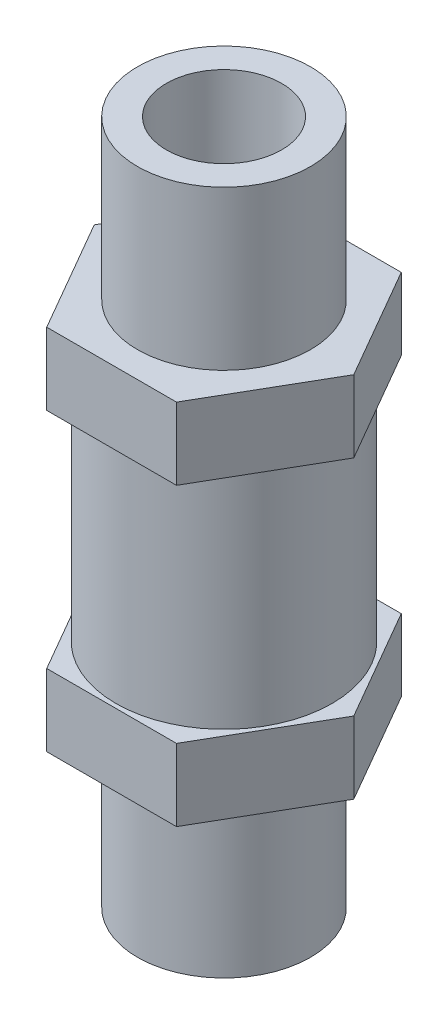
ISO-10303-21;
HEADER;
FILE_DESCRIPTION(('STEP AP214'),'2;1');
FILE_NAME('part.step','',(''),(''),'','','');
FILE_SCHEMA(('AUTOMOTIVE_DESIGN { 1 0 10303 214 1 1 1 1 }'));
ENDSEC;
DATA;
#1=APPLICATION_CONTEXT('core data for automotive mechanical design processes');
#2=APPLICATION_PROTOCOL_DEFINITION('international standard','automotive_design',2000,#1);
#3=PRODUCT_CONTEXT('',#1,'mechanical');
#4=PRODUCT('Part','Part','',(#3));
#5=PRODUCT_RELATED_PRODUCT_CATEGORY('part','',(#4));
#6=PRODUCT_DEFINITION_FORMATION('','',#4);
#7=PRODUCT_DEFINITION_CONTEXT('part definition',#1,'design');
#8=PRODUCT_DEFINITION('design','',#6,#7);
#9=PRODUCT_DEFINITION_SHAPE('','',#8);
#10=(LENGTH_UNIT() NAMED_UNIT(*) SI_UNIT(.MILLI.,.METRE.));
#11=(NAMED_UNIT(*) PLANE_ANGLE_UNIT() SI_UNIT($,.RADIAN.));
#12=(NAMED_UNIT(*) SI_UNIT($,.STERADIAN.) SOLID_ANGLE_UNIT());
#13=UNCERTAINTY_MEASURE_WITH_UNIT(LENGTH_MEASURE(1.E-05),#10,'distance_accuracy_value','');
#14=(GEOMETRIC_REPRESENTATION_CONTEXT(3) GLOBAL_UNCERTAINTY_ASSIGNED_CONTEXT((#13)) GLOBAL_UNIT_ASSIGNED_CONTEXT((#10,
#11,#12)) REPRESENTATION_CONTEXT('',''));
#15=CARTESIAN_POINT('',(0.,0.,0.));
#16=DIRECTION('',(0.,0.,1.));
#17=DIRECTION('',(1.,0.,0.));
#18=AXIS2_PLACEMENT_3D('',#15,#16,#17);
#19=CARTESIAN_POINT('',(5.99999999999999,31.9601930323458,0.));
#20=DIRECTION('',(0.,1.,0.));
#21=DIRECTION('',(-1.,0.,0.));
#22=AXIS2_PLACEMENT_3D('',#19,#20,#21);
#23=PLANE('',#22);
#24=CARTESIAN_POINT('',(0.,31.9601930323458,0.));
#25=DIRECTION('',(0.,-1.,0.));
#26=DIRECTION('',(1.,0.,0.));
#27=AXIS2_PLACEMENT_3D('',#24,#25,#26);
#28=CIRCLE('',#27,6.);
#29=CARTESIAN_POINT('',(5.99999999999999,31.9601930323458,0.));
#30=VERTEX_POINT('',#29);
#31=EDGE_CURVE('E239',#30,#30,#28,.T.);
#32=ORIENTED_EDGE('',*,*,#31,.T.);
#33=EDGE_LOOP('',(#32));
#34=FACE_BOUND('',#33,.T.);
#35=DIRECTION('',(-0.499999999999995,0.,0.866025403784442));
#36=VECTOR('',#35,1.);
#37=CARTESIAN_POINT('',(-6.75000000000002,31.9601930323458,-3.89711431702994));
#38=LINE('',#37,#36);
#39=CARTESIAN_POINT('',(-4.50000000000004,31.9601930323458,-7.79422863405993));
#40=VERTEX_POINT('',#39);
#41=CARTESIAN_POINT('',(-9.,31.9601930323458,0.));
#42=VERTEX_POINT('',#41);
#43=EDGE_CURVE('E152',#40,#42,#38,.T.);
#44=ORIENTED_EDGE('',*,*,#43,.T.);
#45=DIRECTION('',(0.500000000000007,0.,0.866025403784435));
#46=VECTOR('',#45,1.);
#47=CARTESIAN_POINT('',(-6.74999999999997,31.9601930323458,3.89711431703003));
#48=LINE('',#47,#46);
#49=CARTESIAN_POINT('',(-4.49999999999994,31.9601930323458,7.79422863405998));
#50=VERTEX_POINT('',#49);
#51=EDGE_CURVE('E134',#42,#50,#48,.T.);
#52=ORIENTED_EDGE('',*,*,#51,.T.);
#53=DIRECTION('',(1.,0.,0.));
#54=VECTOR('',#53,1.);
#55=CARTESIAN_POINT('',(0.,31.9601930323458,7.79422863405994));
#56=LINE('',#55,#54);
#57=CARTESIAN_POINT('',(4.50000000000009,31.9601930323458,7.79422863405989));
#58=VERTEX_POINT('',#57);
#59=EDGE_CURVE('E144',#50,#58,#56,.T.);
#60=ORIENTED_EDGE('',*,*,#59,.T.);
#61=DIRECTION('',(0.499999999999995,0.,-0.866025403784442));
#62=VECTOR('',#61,1.);
#63=CARTESIAN_POINT('',(6.75000000000004,31.9601930323458,3.89711431702994));
#64=LINE('',#63,#62);
#65=CARTESIAN_POINT('',(8.99999999999999,31.9601930323458,0.));
#66=VERTEX_POINT('',#65);
#67=EDGE_CURVE('E310',#58,#66,#64,.T.);
#68=ORIENTED_EDGE('',*,*,#67,.T.);
#69=DIRECTION('',(-0.500000000000001,0.,-0.866025403784438));
#70=VECTOR('',#69,1.);
#71=CARTESIAN_POINT('',(6.74999999999998,31.9601930323458,-3.89711431702997));
#72=LINE('',#71,#70);
#73=CARTESIAN_POINT('',(4.49999999999997,31.9601930323458,-7.79422863405996));
#74=VERTEX_POINT('',#73);
#75=EDGE_CURVE('E278',#66,#74,#72,.T.);
#76=ORIENTED_EDGE('',*,*,#75,.T.);
#77=DIRECTION('',(-1.,0.,0.));
#78=VECTOR('',#77,1.);
#79=CARTESIAN_POINT('',(0.,31.9601930323458,-7.79422863405994));
#80=LINE('',#79,#78);
#81=EDGE_CURVE('E300',#74,#40,#80,.T.);
#82=ORIENTED_EDGE('',*,*,#81,.T.);
#83=EDGE_LOOP('',(#44,#52,#60,#68,#76,#82));
#84=FACE_BOUND('',#83,.T.);
#85=ADVANCED_FACE('F42',(#34,#84),#23,.T.);
#86=CARTESIAN_POINT('',(8.99999999999999,26.9601930323458,0.));
#87=DIRECTION('',(0.,-1.,0.));
#88=DIRECTION('',(1.,0.,0.));
#89=AXIS2_PLACEMENT_3D('',#86,#87,#88);
#90=PLANE('',#89);
#91=CARTESIAN_POINT('',(0.,26.9601930323458,0.));
#92=DIRECTION('',(0.,-1.,0.));
#93=DIRECTION('',(1.,0.,0.));
#94=AXIS2_PLACEMENT_3D('',#91,#92,#93);
#95=CIRCLE('',#94,7.5);
#96=CARTESIAN_POINT('',(7.5,26.9601930323458,0.));
#97=VERTEX_POINT('',#96);
#98=EDGE_CURVE('E235',#97,#97,#95,.T.);
#99=ORIENTED_EDGE('',*,*,#98,.F.);
#100=EDGE_LOOP('',(#99));
#101=FACE_BOUND('',#100,.T.);
#102=DIRECTION('',(-1.,0.,0.));
#103=VECTOR('',#102,1.);
#104=CARTESIAN_POINT('',(9.00000000000008,26.9601930323458,7.79422863405985));
#105=LINE('',#104,#103);
#106=CARTESIAN_POINT('',(4.50000000000009,26.9601930323458,7.79422863405989));
#107=VERTEX_POINT('',#106);
#108=CARTESIAN_POINT('',(-4.49999999999994,26.9601930323458,7.79422863405998));
#109=VERTEX_POINT('',#108);
#110=EDGE_CURVE('E175',#107,#109,#105,.T.);
#111=ORIENTED_EDGE('',*,*,#110,.T.);
#112=DIRECTION('',(-0.500000000000007,0.,-0.866025403784435));
#113=VECTOR('',#112,1.);
#114=CARTESIAN_POINT('',(-4.4999999999999,26.9601930323458,7.79422863406004));
#115=LINE('',#114,#113);
#116=CARTESIAN_POINT('',(-9.,26.9601930323458,0.));
#117=VERTEX_POINT('',#116);
#118=EDGE_CURVE('E137',#109,#117,#115,.T.);
#119=ORIENTED_EDGE('',*,*,#118,.T.);
#120=DIRECTION('',(0.499999999999995,0.,-0.866025403784442));
#121=VECTOR('',#120,1.);
#122=CARTESIAN_POINT('',(-4.50000000000007,26.9601930323458,-7.79422863405988));
#123=LINE('',#122,#121);
#124=CARTESIAN_POINT('',(-4.50000000000004,26.9601930323458,-7.79422863405993));
#125=VERTEX_POINT('',#124);
#126=EDGE_CURVE('E191',#117,#125,#123,.T.);
#127=ORIENTED_EDGE('',*,*,#126,.T.);
#128=DIRECTION('',(1.,0.,0.));
#129=VECTOR('',#128,1.);
#130=CARTESIAN_POINT('',(8.99999999999997,26.9601930323458,-7.79422863405997));
#131=LINE('',#130,#129);
#132=CARTESIAN_POINT('',(4.49999999999997,26.9601930323458,-7.79422863405996));
#133=VERTEX_POINT('',#132);
#134=EDGE_CURVE('E58',#125,#133,#131,.T.);
#135=ORIENTED_EDGE('',*,*,#134,.T.);
#136=DIRECTION('',(0.500000000000001,0.,0.866025403784438));
#137=VECTOR('',#136,1.);
#138=CARTESIAN_POINT('',(8.99999999999999,26.9601930323458,0.));
#139=LINE('',#138,#137);
#140=CARTESIAN_POINT('',(8.99999999999999,26.9601930323458,0.));
#141=VERTEX_POINT('',#140);
#142=EDGE_CURVE('E183',#133,#141,#139,.T.);
#143=ORIENTED_EDGE('',*,*,#142,.T.);
#144=DIRECTION('',(-0.499999999999995,0.,0.866025403784442));
#145=VECTOR('',#144,1.);
#146=CARTESIAN_POINT('',(8.99999999999999,26.9601930323458,0.));
#147=LINE('',#146,#145);
#148=EDGE_CURVE('E66',#141,#107,#147,.T.);
#149=ORIENTED_EDGE('',*,*,#148,.T.);
#150=EDGE_LOOP('',(#111,#119,#127,#135,#143,#149));
#151=FACE_BOUND('',#150,.T.);
#152=ADVANCED_FACE('F349',(#101,#151),#90,.T.);
#153=CARTESIAN_POINT('',(7.5,11.4601930323458,0.));
#154=DIRECTION('',(0.,1.,0.));
#155=DIRECTION('',(-1.,0.,0.));
#156=AXIS2_PLACEMENT_3D('',#153,#154,#155);
#157=PLANE('',#156);
#158=CARTESIAN_POINT('',(0.,11.4601930323458,0.));
#159=DIRECTION('',(0.,-1.,0.));
#160=DIRECTION('',(1.,0.,0.));
#161=AXIS2_PLACEMENT_3D('',#158,#159,#160);
#162=CIRCLE('',#161,7.5);
#163=CARTESIAN_POINT('',(7.5,11.4601930323458,0.));
#164=VERTEX_POINT('',#163);
#165=EDGE_CURVE('E231',#164,#164,#162,.T.);
#166=ORIENTED_EDGE('',*,*,#165,.T.);
#167=EDGE_LOOP('',(#166));
#168=FACE_BOUND('',#167,.T.);
#169=DIRECTION('',(-0.499999999999995,0.,0.866025403784442));
#170=VECTOR('',#169,1.);
#171=CARTESIAN_POINT('',(-4.87500000000006,11.4601930323458,-7.14470958122156));
#172=LINE('',#171,#170);
#173=CARTESIAN_POINT('',(-4.50000000000004,11.4601930323458,-7.79422863405993));
#174=VERTEX_POINT('',#173);
#175=CARTESIAN_POINT('',(-9.,11.4601930323458,0.));
#176=VERTEX_POINT('',#175);
#177=EDGE_CURVE('E187',#174,#176,#172,.T.);
#178=ORIENTED_EDGE('',*,*,#177,.T.);
#179=DIRECTION('',(0.500000000000007,0.,0.866025403784435));
#180=VECTOR('',#179,1.);
#181=CARTESIAN_POINT('',(-4.87499999999991,11.4601930323458,7.1447095812217));
#182=LINE('',#181,#180);
#183=CARTESIAN_POINT('',(-4.49999999999994,11.4601930323458,7.79422863405998));
#184=VERTEX_POINT('',#183);
#185=EDGE_CURVE('E315',#176,#184,#182,.T.);
#186=ORIENTED_EDGE('',*,*,#185,.T.);
#187=DIRECTION('',(1.,0.,0.));
#188=VECTOR('',#187,1.);
#189=CARTESIAN_POINT('',(7.50000000000008,11.4601930323458,7.79422863405986));
#190=LINE('',#189,#188);
#191=CARTESIAN_POINT('',(4.50000000000009,11.4601930323458,7.79422863405989));
#192=VERTEX_POINT('',#191);
#193=EDGE_CURVE('E171',#184,#192,#190,.T.);
#194=ORIENTED_EDGE('',*,*,#193,.T.);
#195=DIRECTION('',(0.499999999999995,0.,-0.866025403784442));
#196=VECTOR('',#195,1.);
#197=CARTESIAN_POINT('',(8.625,11.4601930323458,0.649519052838321));
#198=LINE('',#197,#196);
#199=CARTESIAN_POINT('',(8.99999999999999,11.4601930323458,0.));
#200=VERTEX_POINT('',#199);
#201=EDGE_CURVE('E305',#192,#200,#198,.T.);
#202=ORIENTED_EDGE('',*,*,#201,.T.);
#203=DIRECTION('',(-0.500000000000001,0.,-0.866025403784438));
#204=VECTOR('',#203,1.);
#205=CARTESIAN_POINT('',(8.62499999999999,11.4601930323458,-0.649519052838325));
#206=LINE('',#205,#204);
#207=CARTESIAN_POINT('',(4.49999999999997,11.4601930323458,-7.79422863405996));
#208=VERTEX_POINT('',#207);
#209=EDGE_CURVE('E179',#200,#208,#206,.T.);
#210=ORIENTED_EDGE('',*,*,#209,.T.);
#211=DIRECTION('',(-1.,0.,0.));
#212=VECTOR('',#211,1.);
#213=CARTESIAN_POINT('',(7.49999999999998,11.4601930323458,-7.79422863405997));
#214=LINE('',#213,#212);
#215=EDGE_CURVE('E162',#208,#174,#214,.T.);
#216=ORIENTED_EDGE('',*,*,#215,.T.);
#217=EDGE_LOOP('',(#178,#186,#194,#202,#210,#216));
#218=FACE_BOUND('',#217,.T.);
#219=ADVANCED_FACE('F335',(#168,#218),#157,.T.);
#220=CARTESIAN_POINT('',(6.00000000000001,6.46019303234576,0.));
#221=DIRECTION('',(0.,-1.,0.));
#222=DIRECTION('',(1.,0.,0.));
#223=AXIS2_PLACEMENT_3D('',#220,#221,#222);
#224=PLANE('',#223);
#225=CARTESIAN_POINT('',(0.,6.46019303234576,0.));
#226=DIRECTION('',(0.,-1.,0.));
#227=DIRECTION('',(1.,0.,0.));
#228=AXIS2_PLACEMENT_3D('',#225,#226,#227);
#229=CIRCLE('',#228,6.);
#230=CARTESIAN_POINT('',(6.00000000000001,6.46019303234576,0.));
#231=VERTEX_POINT('',#230);
#232=EDGE_CURVE('E227',#231,#231,#229,.T.);
#233=ORIENTED_EDGE('',*,*,#232,.F.);
#234=EDGE_LOOP('',(#233));
#235=FACE_BOUND('',#234,.T.);
#236=DIRECTION('',(-1.,0.,0.));
#237=VECTOR('',#236,1.);
#238=CARTESIAN_POINT('',(6.00000000000009,6.46019303234576,7.79422863405988));
#239=LINE('',#238,#237);
#240=CARTESIAN_POINT('',(4.50000000000009,6.46019303234576,7.79422863405989));
#241=VERTEX_POINT('',#240);
#242=CARTESIAN_POINT('',(-4.49999999999994,6.46019303234576,7.79422863405998));
#243=VERTEX_POINT('',#242);
#244=EDGE_CURVE('E251',#241,#243,#239,.T.);
#245=ORIENTED_EDGE('',*,*,#244,.T.);
#246=DIRECTION('',(-0.500000000000007,0.,-0.866025403784435));
#247=VECTOR('',#246,1.);
#248=CARTESIAN_POINT('',(-5.24999999999992,6.46019303234576,6.49519052838337));
#249=LINE('',#248,#247);
#250=CARTESIAN_POINT('',(-9.,6.46019303234576,0.));
#251=VERTEX_POINT('',#250);
#252=EDGE_CURVE('E154',#243,#251,#249,.T.);
#253=ORIENTED_EDGE('',*,*,#252,.T.);
#254=DIRECTION('',(0.499999999999995,0.,-0.866025403784442));
#255=VECTOR('',#254,1.);
#256=CARTESIAN_POINT('',(-5.25000000000005,6.46019303234576,-6.49519052838324));
#257=LINE('',#256,#255);
#258=CARTESIAN_POINT('',(-4.50000000000003,6.46019303234576,-7.79422863405993));
#259=VERTEX_POINT('',#258);
#260=EDGE_CURVE('E11',#251,#259,#257,.T.);
#261=ORIENTED_EDGE('',*,*,#260,.T.);
#262=DIRECTION('',(1.,0.,0.));
#263=VECTOR('',#262,1.);
#264=CARTESIAN_POINT('',(5.99999999999998,6.46019303234576,-7.79422863405996));
#265=LINE('',#264,#263);
#266=CARTESIAN_POINT('',(4.49999999999997,6.46019303234576,-7.79422863405996));
#267=VERTEX_POINT('',#266);
#268=EDGE_CURVE('E263',#259,#267,#265,.T.);
#269=ORIENTED_EDGE('',*,*,#268,.T.);
#270=DIRECTION('',(0.500000000000001,0.,0.866025403784438));
#271=VECTOR('',#270,1.);
#272=CARTESIAN_POINT('',(8.24999999999999,6.46019303234576,-1.29903810567665));
#273=LINE('',#272,#271);
#274=CARTESIAN_POINT('',(9.,6.46019303234576,0.));
#275=VERTEX_POINT('',#274);
#276=EDGE_CURVE('E51',#267,#275,#273,.T.);
#277=ORIENTED_EDGE('',*,*,#276,.T.);
#278=DIRECTION('',(-0.499999999999995,0.,0.866025403784442));
#279=VECTOR('',#278,1.);
#280=CARTESIAN_POINT('',(8.25000000000001,6.46019303234576,1.29903810567664));
#281=LINE('',#280,#279);
#282=EDGE_CURVE('E261',#275,#241,#281,.T.);
#283=ORIENTED_EDGE('',*,*,#282,.T.);
#284=EDGE_LOOP('',(#245,#253,#261,#269,#277,#283));
#285=FACE_BOUND('',#284,.T.);
#286=ADVANCED_FACE('F260',(#235,#285),#224,.T.);
#287=CARTESIAN_POINT('',(0.,15.4601930323458,0.));
#288=DIRECTION('',(0.,-1.,0.));
#289=DIRECTION('',(1.,0.,0.));
#290=AXIS2_PLACEMENT_3D('',#287,#288,#289);
#291=CYLINDRICAL_SURFACE('',#290,4.);
#292=CARTESIAN_POINT('',(0.,32.9601930323458,0.));
#293=DIRECTION('',(0.,-1.,0.));
#294=DIRECTION('',(1.,0.,0.));
#295=AXIS2_PLACEMENT_3D('',#292,#293,#294);
#296=CIRCLE('',#295,4.);
#297=CARTESIAN_POINT('',(4.,32.9601930323458,0.));
#298=VERTEX_POINT('',#297);
#299=EDGE_CURVE('E195',#298,#298,#296,.T.);
#300=ORIENTED_EDGE('',*,*,#299,.T.);
#301=EDGE_LOOP('',(#300));
#302=FACE_BOUND('',#301,.T.);
#303=CARTESIAN_POINT('',(0.,42.9601930323458,0.));
#304=DIRECTION('',(0.,-1.,0.));
#305=DIRECTION('',(1.,0.,0.));
#306=AXIS2_PLACEMENT_3D('',#303,#304,#305);
#307=CIRCLE('',#306,4.);
#308=CARTESIAN_POINT('',(3.99999999999999,42.9601930323458,0.));
#309=VERTEX_POINT('',#308);
#310=EDGE_CURVE('E247',#309,#309,#307,.T.);
#311=ORIENTED_EDGE('',*,*,#310,.F.);
#312=EDGE_LOOP('',(#311));
#313=FACE_BOUND('',#312,.T.);
#314=ADVANCED_FACE('F44',(#302,#313),#291,.F.);
#315=CARTESIAN_POINT('',(3.99999999999999,42.9601930323458,0.));
#316=DIRECTION('',(0.,1.,0.));
#317=DIRECTION('',(-1.,0.,0.));
#318=AXIS2_PLACEMENT_3D('',#315,#316,#317);
#319=PLANE('',#318);
#320=ORIENTED_EDGE('',*,*,#310,.T.);
#321=EDGE_LOOP('',(#320));
#322=FACE_BOUND('',#321,.T.);
#323=CARTESIAN_POINT('',(0.,42.9601930323458,0.));
#324=DIRECTION('',(0.,-1.,0.));
#325=DIRECTION('',(1.,0.,0.));
#326=AXIS2_PLACEMENT_3D('',#323,#324,#325);
#327=CIRCLE('',#326,6.);
#328=CARTESIAN_POINT('',(5.99999999999999,42.9601930323458,0.));
#329=VERTEX_POINT('',#328);
#330=EDGE_CURVE('E243',#329,#329,#327,.T.);
#331=ORIENTED_EDGE('',*,*,#330,.F.);
#332=EDGE_LOOP('',(#331));
#333=FACE_BOUND('',#332,.T.);
#334=ADVANCED_FACE('F362',(#322,#333),#319,.T.);
#335=CARTESIAN_POINT('',(0.,15.4601930323458,0.));
#336=DIRECTION('',(0.,-1.,0.));
#337=DIRECTION('',(1.,0.,0.));
#338=AXIS2_PLACEMENT_3D('',#335,#336,#337);
#339=CYLINDRICAL_SURFACE('',#338,6.);
#340=ORIENTED_EDGE('',*,*,#330,.T.);
#341=EDGE_LOOP('',(#340));
#342=FACE_BOUND('',#341,.T.);
#343=ORIENTED_EDGE('',*,*,#31,.F.);
#344=EDGE_LOOP('',(#343));
#345=FACE_BOUND('',#344,.T.);
#346=ADVANCED_FACE('F359',(#342,#345),#339,.T.);
#347=CARTESIAN_POINT('',(0.,15.4601930323458,0.));
#348=DIRECTION('',(0.,-1.,0.));
#349=DIRECTION('',(1.,0.,0.));
#350=AXIS2_PLACEMENT_3D('',#347,#348,#349);
#351=CYLINDRICAL_SURFACE('',#350,7.5);
#352=ORIENTED_EDGE('',*,*,#98,.T.);
#353=EDGE_LOOP('',(#352));
#354=FACE_BOUND('',#353,.T.);
#355=ORIENTED_EDGE('',*,*,#165,.F.);
#356=EDGE_LOOP('',(#355));
#357=FACE_BOUND('',#356,.T.);
#358=ADVANCED_FACE('F361',(#354,#357),#351,.T.);
#359=CARTESIAN_POINT('',(0.,15.4601930323458,0.));
#360=DIRECTION('',(0.,-1.,0.));
#361=DIRECTION('',(1.,0.,0.));
#362=AXIS2_PLACEMENT_3D('',#359,#360,#361);
#363=CYLINDRICAL_SURFACE('',#362,6.);
#364=ORIENTED_EDGE('',*,*,#232,.T.);
#365=EDGE_LOOP('',(#364));
#366=FACE_BOUND('',#365,.T.);
#367=CARTESIAN_POINT('',(0.,-4.53980696765424,0.));
#368=DIRECTION('',(0.,-1.,0.));
#369=DIRECTION('',(1.,0.,0.));
#370=AXIS2_PLACEMENT_3D('',#367,#368,#369);
#371=CIRCLE('',#370,6.);
#372=CARTESIAN_POINT('',(6.00000000000001,-4.53980696765423,0.));
#373=VERTEX_POINT('',#372);
#374=EDGE_CURVE('E223',#373,#373,#371,.T.);
#375=ORIENTED_EDGE('',*,*,#374,.F.);
#376=EDGE_LOOP('',(#375));
#377=FACE_BOUND('',#376,.T.);
#378=ADVANCED_FACE('F420',(#366,#377),#363,.T.);
#379=CARTESIAN_POINT('',(4.00000000000001,-4.53980696765424,0.));
#380=DIRECTION('',(0.,-1.,0.));
#381=DIRECTION('',(1.,0.,0.));
#382=AXIS2_PLACEMENT_3D('',#379,#380,#381);
#383=PLANE('',#382);
#384=ORIENTED_EDGE('',*,*,#374,.T.);
#385=EDGE_LOOP('',(#384));
#386=FACE_BOUND('',#385,.T.);
#387=CARTESIAN_POINT('',(0.,-4.53980696765424,0.));
#388=DIRECTION('',(0.,-1.,0.));
#389=DIRECTION('',(1.,0.,0.));
#390=AXIS2_PLACEMENT_3D('',#387,#388,#389);
#391=CIRCLE('',#390,4.00000000000001);
#392=CARTESIAN_POINT('',(4.00000000000001,-4.53980696765424,0.));
#393=VERTEX_POINT('',#392);
#394=EDGE_CURVE('E219',#393,#393,#391,.T.);
#395=ORIENTED_EDGE('',*,*,#394,.F.);
#396=EDGE_LOOP('',(#395));
#397=FACE_BOUND('',#396,.T.);
#398=ADVANCED_FACE('F416',(#386,#397),#383,.T.);
#399=CARTESIAN_POINT('',(0.,15.4601930323458,0.));
#400=DIRECTION('',(0.,-1.,0.));
#401=DIRECTION('',(1.,0.,0.));
#402=AXIS2_PLACEMENT_3D('',#399,#400,#401);
#403=CYLINDRICAL_SURFACE('',#402,4.00000000000001);
#404=ORIENTED_EDGE('',*,*,#394,.T.);
#405=EDGE_LOOP('',(#404));
#406=FACE_BOUND('',#405,.T.);
#407=CARTESIAN_POINT('',(0.,5.46019303234576,0.));
#408=DIRECTION('',(0.,-1.,0.));
#409=DIRECTION('',(1.,0.,0.));
#410=AXIS2_PLACEMENT_3D('',#407,#408,#409);
#411=CIRCLE('',#410,4.00000000000001);
#412=CARTESIAN_POINT('',(4.00000000000001,5.46019303234576,0.));
#413=VERTEX_POINT('',#412);
#414=EDGE_CURVE('E215',#413,#413,#411,.T.);
#415=ORIENTED_EDGE('',*,*,#414,.F.);
#416=EDGE_LOOP('',(#415));
#417=FACE_BOUND('',#416,.T.);
#418=ADVANCED_FACE('F412',(#406,#417),#403,.F.);
#419=CARTESIAN_POINT('',(4.00000000000001,5.46019303234576,0.));
#420=DIRECTION('',(0.,-1.,0.));
#421=DIRECTION('',(1.,0.,0.));
#422=AXIS2_PLACEMENT_3D('',#419,#420,#421);
#423=PLANE('',#422);
#424=ORIENTED_EDGE('',*,*,#414,.T.);
#425=EDGE_LOOP('',(#424));
#426=FACE_BOUND('',#425,.T.);
#427=CARTESIAN_POINT('',(0.,5.46019303234576,0.));
#428=DIRECTION('',(0.,-1.,0.));
#429=DIRECTION('',(1.,0.,0.));
#430=AXIS2_PLACEMENT_3D('',#427,#428,#429);
#431=CIRCLE('',#430,2.5);
#432=CARTESIAN_POINT('',(2.5,5.46019303234576,0.));
#433=VERTEX_POINT('',#432);
#434=EDGE_CURVE('E211',#433,#433,#431,.T.);
#435=ORIENTED_EDGE('',*,*,#434,.F.);
#436=EDGE_LOOP('',(#435));
#437=FACE_BOUND('',#436,.T.);
#438=ADVANCED_FACE('F408',(#426,#437),#423,.T.);
#439=CARTESIAN_POINT('',(0.,15.4601930323458,0.));
#440=DIRECTION('',(0.,-1.,0.));
#441=DIRECTION('',(1.,0.,0.));
#442=AXIS2_PLACEMENT_3D('',#439,#440,#441);
#443=CYLINDRICAL_SURFACE('',#442,2.5);
#444=ORIENTED_EDGE('',*,*,#434,.T.);
#445=EDGE_LOOP('',(#444));
#446=FACE_BOUND('',#445,.T.);
#447=CARTESIAN_POINT('',(0.,15.4601930323458,0.));
#448=DIRECTION('',(0.,-1.,0.));
#449=DIRECTION('',(1.,0.,0.));
#450=AXIS2_PLACEMENT_3D('',#447,#448,#449);
#451=CIRCLE('',#450,2.5);
#452=CARTESIAN_POINT('',(2.5,15.4601930323458,0.));
#453=VERTEX_POINT('',#452);
#454=EDGE_CURVE('E207',#453,#453,#451,.T.);
#455=ORIENTED_EDGE('',*,*,#454,.F.);
#456=EDGE_LOOP('',(#455));
#457=FACE_BOUND('',#456,.T.);
#458=ADVANCED_FACE('F404',(#446,#457),#443,.F.);
#459=CARTESIAN_POINT('',(0.,15.4601930323458,0.));
#460=DIRECTION('',(0.,-1.,0.));
#461=DIRECTION('',(1.,0.,0.));
#462=AXIS2_PLACEMENT_3D('',#459,#460,#461);
#463=PLANE('',#462);
#464=ORIENTED_EDGE('',*,*,#454,.T.);
#465=EDGE_LOOP('',(#464));
#466=FACE_BOUND('',#465,.T.);
#467=ADVANCED_FACE('F400',(#466),#463,.T.);
#468=CARTESIAN_POINT('',(2.5,23.9601930323458,0.));
#469=DIRECTION('',(0.,1.,0.));
#470=DIRECTION('',(-1.,0.,0.));
#471=AXIS2_PLACEMENT_3D('',#468,#469,#470);
#472=PLANE('',#471);
#473=CARTESIAN_POINT('',(0.,23.9601930323458,0.));
#474=DIRECTION('',(0.,-1.,0.));
#475=DIRECTION('',(1.,0.,0.));
#476=AXIS2_PLACEMENT_3D('',#473,#474,#475);
#477=CIRCLE('',#476,2.5);
#478=CARTESIAN_POINT('',(2.5,23.9601930323458,0.));
#479=VERTEX_POINT('',#478);
#480=EDGE_CURVE('E203',#479,#479,#477,.T.);
#481=ORIENTED_EDGE('',*,*,#480,.F.);
#482=EDGE_LOOP('',(#481));
#483=FACE_BOUND('',#482,.T.);
#484=ADVANCED_FACE('F393',(#483),#472,.T.);
#485=CARTESIAN_POINT('',(0.,15.4601930323458,0.));
#486=DIRECTION('',(0.,-1.,0.));
#487=DIRECTION('',(1.,0.,0.));
#488=AXIS2_PLACEMENT_3D('',#485,#486,#487);
#489=CYLINDRICAL_SURFACE('',#488,2.5);
#490=ORIENTED_EDGE('',*,*,#480,.T.);
#491=EDGE_LOOP('',(#490));
#492=FACE_BOUND('',#491,.T.);
#493=CARTESIAN_POINT('',(0.,32.9601930323458,0.));
#494=DIRECTION('',(0.,-1.,0.));
#495=DIRECTION('',(1.,0.,0.));
#496=AXIS2_PLACEMENT_3D('',#493,#494,#495);
#497=CIRCLE('',#496,2.5);
#498=CARTESIAN_POINT('',(2.5,32.9601930323458,0.));
#499=VERTEX_POINT('',#498);
#500=EDGE_CURVE('E199',#499,#499,#497,.T.);
#501=ORIENTED_EDGE('',*,*,#500,.F.);
#502=EDGE_LOOP('',(#501));
#503=FACE_BOUND('',#502,.T.);
#504=ADVANCED_FACE('F385',(#492,#503),#489,.F.);
#505=CARTESIAN_POINT('',(4.,32.9601930323458,0.));
#506=DIRECTION('',(0.,1.,0.));
#507=DIRECTION('',(-1.,0.,0.));
#508=AXIS2_PLACEMENT_3D('',#505,#506,#507);
#509=PLANE('',#508);
#510=ORIENTED_EDGE('',*,*,#500,.T.);
#511=EDGE_LOOP('',(#510));
#512=FACE_BOUND('',#511,.T.);
#513=ORIENTED_EDGE('',*,*,#299,.F.);
#514=EDGE_LOOP('',(#513));
#515=FACE_BOUND('',#514,.T.);
#516=ADVANCED_FACE('F383',(#512,#515),#509,.T.);
#517=CARTESIAN_POINT('',(0.,1.96019303234575,7.79422863405994));
#518=DIRECTION('',(0.,0.,1.));
#519=DIRECTION('',(1.,0.,0.));
#520=AXIS2_PLACEMENT_3D('',#517,#518,#519);
#521=PLANE('',#520);
#522=DIRECTION('',(0.,1.,0.));
#523=VECTOR('',#522,1.);
#524=CARTESIAN_POINT('',(-4.49999999999994,1.96019303234575,7.79422863405998));
#525=LINE('',#524,#523);
#526=EDGE_CURVE('E143',#243,#184,#525,.T.);
#527=ORIENTED_EDGE('',*,*,#526,.F.);
#528=ORIENTED_EDGE('',*,*,#244,.F.);
#529=DIRECTION('',(0.,1.,0.));
#530=VECTOR('',#529,1.);
#531=CARTESIAN_POINT('',(4.50000000000009,1.96019303234575,7.79422863405989));
#532=LINE('',#531,#530);
#533=EDGE_CURVE('E169',#241,#192,#532,.T.);
#534=ORIENTED_EDGE('',*,*,#533,.T.);
#535=ORIENTED_EDGE('',*,*,#193,.F.);
#536=EDGE_LOOP('',(#527,#528,#534,#535));
#537=FACE_BOUND('',#536,.T.);
#538=ADVANCED_FACE('F339',(#537),#521,.T.);
#539=CARTESIAN_POINT('',(6.74999999999998,1.96019303234575,-3.89711431702997));
#540=DIRECTION('',(0.866025403784438,0.,-0.500000000000001));
#541=DIRECTION('',(-0.500000000000001,0.,-0.866025403784438));
#542=AXIS2_PLACEMENT_3D('',#539,#540,#541);
#543=PLANE('',#542);
#544=DIRECTION('',(0.,1.,0.));
#545=VECTOR('',#544,1.);
#546=CARTESIAN_POINT('',(8.99999999999999,1.96019303234575,0.));
#547=LINE('',#546,#545);
#548=EDGE_CURVE('E270',#275,#200,#547,.T.);
#549=ORIENTED_EDGE('',*,*,#548,.F.);
#550=ORIENTED_EDGE('',*,*,#276,.F.);
#551=DIRECTION('',(0.,1.,0.));
#552=VECTOR('',#551,1.);
#553=CARTESIAN_POINT('',(4.49999999999997,1.96019303234575,-7.79422863405996));
#554=LINE('',#553,#552);
#555=EDGE_CURVE('E269',#267,#208,#554,.T.);
#556=ORIENTED_EDGE('',*,*,#555,.T.);
#557=ORIENTED_EDGE('',*,*,#209,.F.);
#558=EDGE_LOOP('',(#549,#550,#556,#557));
#559=FACE_BOUND('',#558,.T.);
#560=ADVANCED_FACE('F267',(#559),#543,.T.);
#561=CARTESIAN_POINT('',(-6.75000000000002,1.96019303234575,-3.89711431702994));
#562=DIRECTION('',(-0.866025403784441,0.,-0.499999999999995));
#563=DIRECTION('',(-0.499999999999995,0.,0.866025403784442));
#564=AXIS2_PLACEMENT_3D('',#561,#562,#563);
#565=PLANE('',#564);
#566=DIRECTION('',(0.,1.,0.));
#567=VECTOR('',#566,1.);
#568=CARTESIAN_POINT('',(-4.50000000000004,1.96019303234575,-7.79422863405993));
#569=LINE('',#568,#567);
#570=EDGE_CURVE('E289',#259,#174,#569,.T.);
#571=ORIENTED_EDGE('',*,*,#570,.F.);
#572=ORIENTED_EDGE('',*,*,#260,.F.);
#573=DIRECTION('',(0.,1.,0.));
#574=VECTOR('',#573,1.);
#575=CARTESIAN_POINT('',(-9.,1.96019303234575,0.));
#576=LINE('',#575,#574);
#577=EDGE_CURVE('E176',#251,#176,#576,.T.);
#578=ORIENTED_EDGE('',*,*,#577,.T.);
#579=ORIENTED_EDGE('',*,*,#177,.F.);
#580=EDGE_LOOP('',(#571,#572,#578,#579));
#581=FACE_BOUND('',#580,.T.);
#582=ADVANCED_FACE('F327',(#581),#565,.T.);
#583=EDGE_CURVE('E158',#107,#58,#532,.T.);
#584=ORIENTED_EDGE('',*,*,#583,.T.);
#585=ORIENTED_EDGE('',*,*,#59,.F.);
#586=EDGE_CURVE('E131',#109,#50,#525,.T.);
#587=ORIENTED_EDGE('',*,*,#586,.F.);
#588=ORIENTED_EDGE('',*,*,#110,.F.);
#589=EDGE_LOOP('',(#584,#585,#587,#588));
#590=FACE_BOUND('',#589,.T.);
#591=ADVANCED_FACE('F157',(#590),#521,.T.);
#592=EDGE_CURVE('E274',#133,#74,#554,.T.);
#593=ORIENTED_EDGE('',*,*,#592,.T.);
#594=ORIENTED_EDGE('',*,*,#75,.F.);
#595=EDGE_CURVE('E166',#141,#66,#547,.T.);
#596=ORIENTED_EDGE('',*,*,#595,.F.);
#597=ORIENTED_EDGE('',*,*,#142,.F.);
#598=EDGE_LOOP('',(#593,#594,#596,#597));
#599=FACE_BOUND('',#598,.T.);
#600=ADVANCED_FACE('F438',(#599),#543,.T.);
#601=EDGE_CURVE('E290',#117,#42,#576,.T.);
#602=ORIENTED_EDGE('',*,*,#601,.T.);
#603=ORIENTED_EDGE('',*,*,#43,.F.);
#604=EDGE_CURVE('E286',#125,#40,#569,.T.);
#605=ORIENTED_EDGE('',*,*,#604,.F.);
#606=ORIENTED_EDGE('',*,*,#126,.F.);
#607=EDGE_LOOP('',(#602,#603,#605,#606));
#608=FACE_BOUND('',#607,.T.);
#609=ADVANCED_FACE('F441',(#608),#565,.T.);
#610=CARTESIAN_POINT('',(0.,1.96019303234575,-7.79422863405994));
#611=DIRECTION('',(0.,0.,-1.));
#612=DIRECTION('',(-1.,0.,0.));
#613=AXIS2_PLACEMENT_3D('',#610,#611,#612);
#614=PLANE('',#613);
#615=ORIENTED_EDGE('',*,*,#604,.T.);
#616=ORIENTED_EDGE('',*,*,#81,.F.);
#617=ORIENTED_EDGE('',*,*,#592,.F.);
#618=ORIENTED_EDGE('',*,*,#134,.F.);
#619=EDGE_LOOP('',(#615,#616,#617,#618));
#620=FACE_BOUND('',#619,.T.);
#621=ADVANCED_FACE('F439',(#620),#614,.T.);
#622=ORIENTED_EDGE('',*,*,#555,.F.);
#623=ORIENTED_EDGE('',*,*,#268,.F.);
#624=ORIENTED_EDGE('',*,*,#570,.T.);
#625=ORIENTED_EDGE('',*,*,#215,.F.);
#626=EDGE_LOOP('',(#622,#623,#624,#625));
#627=FACE_BOUND('',#626,.T.);
#628=ADVANCED_FACE('F333',(#627),#614,.T.);
#629=CARTESIAN_POINT('',(6.75000000000004,1.96019303234575,3.89711431702994));
#630=DIRECTION('',(0.866025403784441,0.,0.499999999999995));
#631=DIRECTION('',(0.499999999999995,0.,-0.866025403784442));
#632=AXIS2_PLACEMENT_3D('',#629,#630,#631);
#633=PLANE('',#632);
#634=ORIENTED_EDGE('',*,*,#595,.T.);
#635=ORIENTED_EDGE('',*,*,#67,.F.);
#636=ORIENTED_EDGE('',*,*,#583,.F.);
#637=ORIENTED_EDGE('',*,*,#148,.F.);
#638=EDGE_LOOP('',(#634,#635,#636,#637));
#639=FACE_BOUND('',#638,.T.);
#640=ADVANCED_FACE('F629',(#639),#633,.T.);
#641=ORIENTED_EDGE('',*,*,#533,.F.);
#642=ORIENTED_EDGE('',*,*,#282,.F.);
#643=ORIENTED_EDGE('',*,*,#548,.T.);
#644=ORIENTED_EDGE('',*,*,#201,.F.);
#645=EDGE_LOOP('',(#641,#642,#643,#644));
#646=FACE_BOUND('',#645,.T.);
#647=ADVANCED_FACE('F337',(#646),#633,.T.);
#648=CARTESIAN_POINT('',(-6.74999999999997,1.96019303234575,3.89711431703003));
#649=DIRECTION('',(-0.866025403784435,0.,0.500000000000007));
#650=DIRECTION('',(0.500000000000007,0.,0.866025403784435));
#651=AXIS2_PLACEMENT_3D('',#648,#649,#650);
#652=PLANE('',#651);
#653=ORIENTED_EDGE('',*,*,#586,.T.);
#654=ORIENTED_EDGE('',*,*,#51,.F.);
#655=ORIENTED_EDGE('',*,*,#601,.F.);
#656=ORIENTED_EDGE('',*,*,#118,.F.);
#657=EDGE_LOOP('',(#653,#654,#655,#656));
#658=FACE_BOUND('',#657,.T.);
#659=ADVANCED_FACE('F133',(#658),#652,.T.);
#660=ORIENTED_EDGE('',*,*,#577,.F.);
#661=ORIENTED_EDGE('',*,*,#252,.F.);
#662=ORIENTED_EDGE('',*,*,#526,.T.);
#663=ORIENTED_EDGE('',*,*,#185,.F.);
#664=EDGE_LOOP('',(#660,#661,#662,#663));
#665=FACE_BOUND('',#664,.T.);
#666=ADVANCED_FACE('F341',(#665),#652,.T.);
#667=CLOSED_SHELL('',(#85,#152,#219,#286,#314,#334,#346,#358,#378,#398,#418,#438,#458,#467,#484,
#504,#516,#538,#560,#582,#591,#600,#609,#621,#628,#640,#647,#659,#666));
#668=MANIFOLD_SOLID_BREP('B2',#667);
#669=ADVANCED_BREP_SHAPE_REPRESENTATION('',(#18,#668),#14);
#670=SHAPE_DEFINITION_REPRESENTATION(#9,#669);
ENDSEC;
END-ISO-10303-21;
